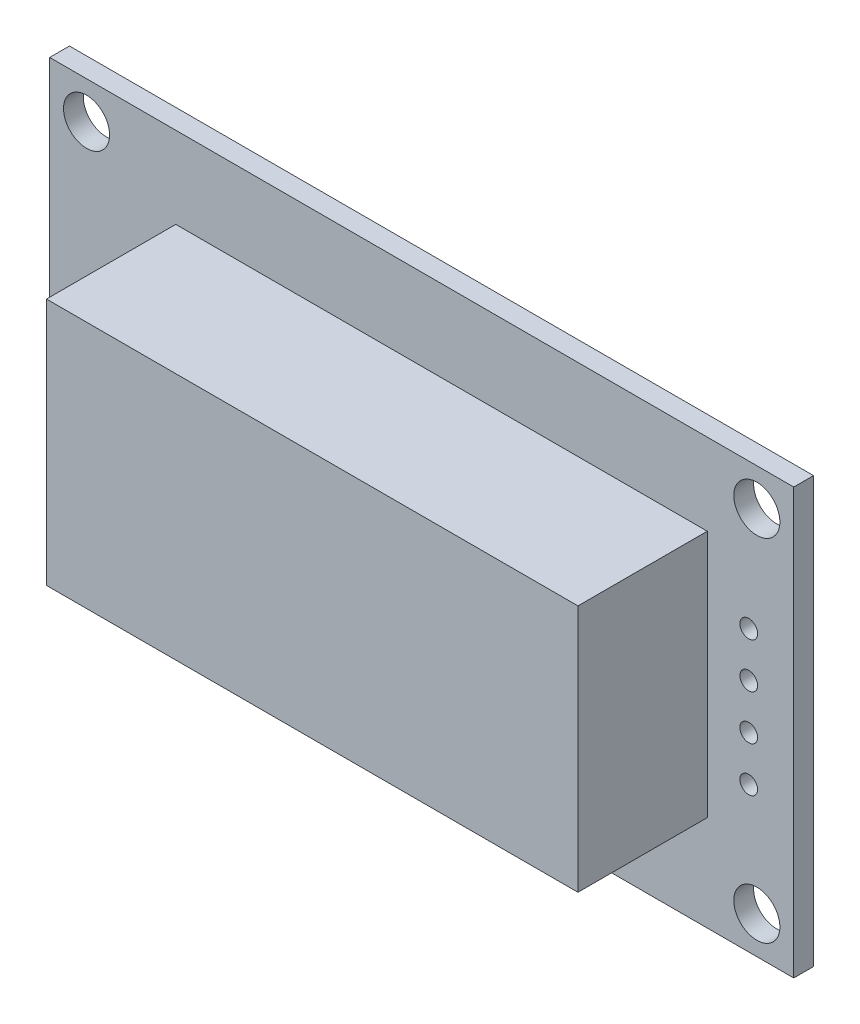
ISO-10303-21;
HEADER;
FILE_DESCRIPTION(('STEP AP214'),'2;1');
FILE_NAME('part.step','',(''),(''),'','','');
FILE_SCHEMA(('AUTOMOTIVE_DESIGN { 1 0 10303 214 1 1 1 1 }'));
ENDSEC;
DATA;
#1=APPLICATION_CONTEXT('core data for automotive mechanical design processes');
#2=APPLICATION_PROTOCOL_DEFINITION('international standard','automotive_design',2000,#1);
#3=PRODUCT_CONTEXT('',#1,'mechanical');
#4=PRODUCT('Part','Part','',(#3));
#5=PRODUCT_RELATED_PRODUCT_CATEGORY('part','',(#4));
#6=PRODUCT_DEFINITION_FORMATION('','',#4);
#7=PRODUCT_DEFINITION_CONTEXT('part definition',#1,'design');
#8=PRODUCT_DEFINITION('design','',#6,#7);
#9=PRODUCT_DEFINITION_SHAPE('','',#8);
#10=(LENGTH_UNIT() NAMED_UNIT(*) SI_UNIT(.MILLI.,.METRE.));
#11=(NAMED_UNIT(*) PLANE_ANGLE_UNIT() SI_UNIT($,.RADIAN.));
#12=(NAMED_UNIT(*) SI_UNIT($,.STERADIAN.) SOLID_ANGLE_UNIT());
#13=UNCERTAINTY_MEASURE_WITH_UNIT(LENGTH_MEASURE(1.E-05),#10,'distance_accuracy_value','');
#14=(GEOMETRIC_REPRESENTATION_CONTEXT(3) GLOBAL_UNCERTAINTY_ASSIGNED_CONTEXT((#13)) GLOBAL_UNIT_ASSIGNED_CONTEXT((#10,
#11,#12)) REPRESENTATION_CONTEXT('',''));
#15=CARTESIAN_POINT('',(0.,0.,0.));
#16=DIRECTION('',(0.,0.,1.));
#17=DIRECTION('',(1.,0.,0.));
#18=AXIS2_PLACEMENT_3D('',#15,#16,#17);
#19=CARTESIAN_POINT('',(0.,0.,0.));
#20=DIRECTION('',(0.,0.,1.));
#21=DIRECTION('',(1.,0.,0.));
#22=AXIS2_PLACEMENT_3D('',#19,#20,#21);
#23=PLANE('',#22);
#24=DIRECTION('',(0.,-1.,0.));
#25=VECTOR('',#24,1.);
#26=CARTESIAN_POINT('',(-8.64,5.9,0.));
#27=LINE('',#26,#25);
#28=CARTESIAN_POINT('',(-8.64,5.9,0.));
#29=VERTEX_POINT('',#28);
#30=CARTESIAN_POINT('',(-8.64000000000001,-6.35,0.));
#31=VERTEX_POINT('',#30);
#32=EDGE_CURVE('E167',#29,#31,#27,.T.);
#33=ORIENTED_EDGE('',*,*,#32,.F.);
#34=DIRECTION('',(1.,0.,0.));
#35=VECTOR('',#34,1.);
#36=CARTESIAN_POINT('',(-8.64,5.9,0.));
#37=LINE('',#36,#35);
#38=CARTESIAN_POINT('',(-17.64,5.9,0.));
#39=VERTEX_POINT('',#38);
#40=EDGE_CURVE('E180',#39,#29,#37,.T.);
#41=ORIENTED_EDGE('',*,*,#40,.F.);
#42=DIRECTION('',(0.,1.,0.));
#43=VECTOR('',#42,1.);
#44=CARTESIAN_POINT('',(-17.64,5.9,0.));
#45=LINE('',#44,#43);
#46=CARTESIAN_POINT('',(-17.64,-6.35,0.));
#47=VERTEX_POINT('',#46);
#48=EDGE_CURVE('E189',#47,#39,#45,.T.);
#49=ORIENTED_EDGE('',*,*,#48,.F.);
#50=DIRECTION('',(-1.,0.,0.));
#51=VECTOR('',#50,1.);
#52=CARTESIAN_POINT('',(-8.64000000000001,-6.35,0.));
#53=LINE('',#52,#51);
#54=EDGE_CURVE('E170',#31,#47,#53,.T.);
#55=ORIENTED_EDGE('',*,*,#54,.F.);
#56=EDGE_LOOP('',(#33,#41,#49,#55));
#57=FACE_BOUND('',#56,.T.);
#58=CARTESIAN_POINT('',(18.46,3.81,0.));
#59=DIRECTION('',(0.,0.,1.));
#60=DIRECTION('',(1.,0.,0.));
#61=AXIS2_PLACEMENT_3D('',#58,#59,#60);
#62=CIRCLE('',#61,0.499999999999999);
#63=CARTESIAN_POINT('',(18.96,3.81,0.));
#64=VERTEX_POINT('',#63);
#65=EDGE_CURVE('E206',#64,#64,#62,.T.);
#66=ORIENTED_EDGE('',*,*,#65,.T.);
#67=EDGE_LOOP('',(#66));
#68=FACE_BOUND('',#67,.T.);
#69=CARTESIAN_POINT('',(18.46,1.27,0.));
#70=DIRECTION('',(0.,0.,1.));
#71=DIRECTION('',(1.,0.,0.));
#72=AXIS2_PLACEMENT_3D('',#69,#70,#71);
#73=CIRCLE('',#72,0.499999999999999);
#74=CARTESIAN_POINT('',(18.96,1.27,0.));
#75=VERTEX_POINT('',#74);
#76=EDGE_CURVE('E210',#75,#75,#73,.T.);
#77=ORIENTED_EDGE('',*,*,#76,.T.);
#78=EDGE_LOOP('',(#77));
#79=FACE_BOUND('',#78,.T.);
#80=CARTESIAN_POINT('',(18.46,-1.27,0.));
#81=DIRECTION('',(0.,0.,1.));
#82=DIRECTION('',(1.,0.,0.));
#83=AXIS2_PLACEMENT_3D('',#80,#81,#82);
#84=CIRCLE('',#83,0.499999999999999);
#85=CARTESIAN_POINT('',(18.96,-1.27,0.));
#86=VERTEX_POINT('',#85);
#87=EDGE_CURVE('E213',#86,#86,#84,.T.);
#88=ORIENTED_EDGE('',*,*,#87,.T.);
#89=EDGE_LOOP('',(#88));
#90=FACE_BOUND('',#89,.T.);
#91=CARTESIAN_POINT('',(18.46,-3.81,0.));
#92=DIRECTION('',(0.,0.,1.));
#93=DIRECTION('',(1.,0.,0.));
#94=AXIS2_PLACEMENT_3D('',#91,#92,#93);
#95=CIRCLE('',#94,0.499999999999999);
#96=CARTESIAN_POINT('',(18.96,-3.81,0.));
#97=VERTEX_POINT('',#96);
#98=EDGE_CURVE('E205',#97,#97,#95,.T.);
#99=ORIENTED_EDGE('',*,*,#98,.T.);
#100=EDGE_LOOP('',(#99));
#101=FACE_BOUND('',#100,.T.);
#102=CARTESIAN_POINT('',(18.9175,9.8975,0.));
#103=DIRECTION('',(0.,0.,1.));
#104=DIRECTION('',(1.,0.,0.));
#105=AXIS2_PLACEMENT_3D('',#102,#103,#104);
#106=CIRCLE('',#105,1.3);
#107=CARTESIAN_POINT('',(20.2175,9.8975,0.));
#108=VERTEX_POINT('',#107);
#109=EDGE_CURVE('E262',#108,#108,#106,.T.);
#110=ORIENTED_EDGE('',*,*,#109,.T.);
#111=EDGE_LOOP('',(#110));
#112=FACE_BOUND('',#111,.T.);
#113=CARTESIAN_POINT('',(18.9175,-9.8975,0.));
#114=DIRECTION('',(0.,0.,1.));
#115=DIRECTION('',(1.,0.,0.));
#116=AXIS2_PLACEMENT_3D('',#113,#114,#115);
#117=CIRCLE('',#116,1.3);
#118=CARTESIAN_POINT('',(20.2175,-9.8975,0.));
#119=VERTEX_POINT('',#118);
#120=EDGE_CURVE('E273',#119,#119,#117,.T.);
#121=ORIENTED_EDGE('',*,*,#120,.T.);
#122=EDGE_LOOP('',(#121));
#123=FACE_BOUND('',#122,.T.);
#124=CARTESIAN_POINT('',(-18.9175,-9.8975,0.));
#125=DIRECTION('',(0.,0.,1.));
#126=DIRECTION('',(1.,0.,0.));
#127=AXIS2_PLACEMENT_3D('',#124,#125,#126);
#128=CIRCLE('',#127,1.3);
#129=CARTESIAN_POINT('',(-17.6175,-9.8975,0.));
#130=VERTEX_POINT('',#129);
#131=EDGE_CURVE('E267',#130,#130,#128,.T.);
#132=ORIENTED_EDGE('',*,*,#131,.T.);
#133=EDGE_LOOP('',(#132));
#134=FACE_BOUND('',#133,.T.);
#135=CARTESIAN_POINT('',(-18.9175,9.8975,0.));
#136=DIRECTION('',(0.,0.,1.));
#137=DIRECTION('',(1.,0.,0.));
#138=AXIS2_PLACEMENT_3D('',#135,#136,#137);
#139=CIRCLE('',#138,1.3);
#140=CARTESIAN_POINT('',(-17.6175,9.8975,0.));
#141=VERTEX_POINT('',#140);
#142=EDGE_CURVE('E266',#141,#141,#139,.T.);
#143=ORIENTED_EDGE('',*,*,#142,.T.);
#144=EDGE_LOOP('',(#143));
#145=FACE_BOUND('',#144,.T.);
#146=DIRECTION('',(0.,-1.,0.));
#147=VECTOR('',#146,1.);
#148=CARTESIAN_POINT('',(-21.,12.,0.));
#149=LINE('',#148,#147);
#150=CARTESIAN_POINT('',(-21.,12.,0.));
#151=VERTEX_POINT('',#150);
#152=CARTESIAN_POINT('',(-21.,-12.,0.));
#153=VERTEX_POINT('',#152);
#154=EDGE_CURVE('E284',#151,#153,#149,.T.);
#155=ORIENTED_EDGE('',*,*,#154,.F.);
#156=DIRECTION('',(-1.,0.,0.));
#157=VECTOR('',#156,1.);
#158=CARTESIAN_POINT('',(-21.,12.,0.));
#159=LINE('',#158,#157);
#160=CARTESIAN_POINT('',(21.,12.,0.));
#161=VERTEX_POINT('',#160);
#162=EDGE_CURVE('E291',#161,#151,#159,.T.);
#163=ORIENTED_EDGE('',*,*,#162,.F.);
#164=DIRECTION('',(0.,1.,0.));
#165=VECTOR('',#164,1.);
#166=CARTESIAN_POINT('',(21.,12.,0.));
#167=LINE('',#166,#165);
#168=CARTESIAN_POINT('',(21.,-12.,0.));
#169=VERTEX_POINT('',#168);
#170=EDGE_CURVE('E302',#169,#161,#167,.T.);
#171=ORIENTED_EDGE('',*,*,#170,.F.);
#172=DIRECTION('',(1.,0.,0.));
#173=VECTOR('',#172,1.);
#174=CARTESIAN_POINT('',(-21.,-12.,0.));
#175=LINE('',#174,#173);
#176=EDGE_CURVE('E300',#153,#169,#175,.T.);
#177=ORIENTED_EDGE('',*,*,#176,.F.);
#178=EDGE_LOOP('',(#155,#163,#171,#177));
#179=FACE_BOUND('',#178,.T.);
#180=DIRECTION('',(0.,-1.,0.));
#181=VECTOR('',#180,1.);
#182=CARTESIAN_POINT('',(-13.84,8.2092,0.));
#183=LINE('',#182,#181);
#184=CARTESIAN_POINT('',(-13.84,9.4092,0.));
#185=VERTEX_POINT('',#184);
#186=CARTESIAN_POINT('',(-13.84,8.2092,0.));
#187=VERTEX_POINT('',#186);
#188=EDGE_CURVE('E166',#185,#187,#183,.T.);
#189=ORIENTED_EDGE('',*,*,#188,.F.);
#190=DIRECTION('',(1.,0.,0.));
#191=VECTOR('',#190,1.);
#192=CARTESIAN_POINT('',(-13.84,9.4092,0.));
#193=LINE('',#192,#191);
#194=CARTESIAN_POINT('',(-17.,9.4092,0.));
#195=VERTEX_POINT('',#194);
#196=EDGE_CURVE('E163',#195,#185,#193,.T.);
#197=ORIENTED_EDGE('',*,*,#196,.F.);
#198=DIRECTION('',(0.,1.,0.));
#199=VECTOR('',#198,1.);
#200=CARTESIAN_POINT('',(-17.,8.2092,0.));
#201=LINE('',#200,#199);
#202=CARTESIAN_POINT('',(-17.,8.2092,0.));
#203=VERTEX_POINT('',#202);
#204=EDGE_CURVE('E53',#203,#195,#201,.T.);
#205=ORIENTED_EDGE('',*,*,#204,.F.);
#206=DIRECTION('',(-1.,0.,0.));
#207=VECTOR('',#206,1.);
#208=CARTESIAN_POINT('',(-13.84,8.2092,0.));
#209=LINE('',#208,#207);
#210=EDGE_CURVE('E48',#187,#203,#209,.T.);
#211=ORIENTED_EDGE('',*,*,#210,.F.);
#212=EDGE_LOOP('',(#189,#197,#205,#211));
#213=FACE_BOUND('',#212,.T.);
#214=ADVANCED_FACE('F33',(#57,#68,#79,#90,#101,#112,#123,#134,#145,#179,#213),#23,.F.);
#215=CARTESIAN_POINT('',(-21.,12.,1.1176));
#216=DIRECTION('',(1.,0.,0.));
#217=DIRECTION('',(0.,1.,0.));
#218=AXIS2_PLACEMENT_3D('',#215,#216,#217);
#219=PLANE('',#218);
#220=ORIENTED_EDGE('',*,*,#154,.T.);
#221=DIRECTION('',(0.,0.,-1.));
#222=VECTOR('',#221,1.);
#223=CARTESIAN_POINT('',(-21.,-12.,1.1176));
#224=LINE('',#223,#222);
#225=CARTESIAN_POINT('',(-21.,-12.,1.1176));
#226=VERTEX_POINT('',#225);
#227=EDGE_CURVE('E11',#226,#153,#224,.T.);
#228=ORIENTED_EDGE('',*,*,#227,.F.);
#229=DIRECTION('',(0.,-1.,0.));
#230=VECTOR('',#229,1.);
#231=CARTESIAN_POINT('',(-21.,12.,1.1176));
#232=LINE('',#231,#230);
#233=CARTESIAN_POINT('',(-21.,12.,1.1176));
#234=VERTEX_POINT('',#233);
#235=EDGE_CURVE('E287',#234,#226,#232,.T.);
#236=ORIENTED_EDGE('',*,*,#235,.F.);
#237=DIRECTION('',(0.,0.,-1.));
#238=VECTOR('',#237,1.);
#239=CARTESIAN_POINT('',(-21.,12.,1.1176));
#240=LINE('',#239,#238);
#241=EDGE_CURVE('E297',#234,#151,#240,.T.);
#242=ORIENTED_EDGE('',*,*,#241,.T.);
#243=EDGE_LOOP('',(#220,#228,#236,#242));
#244=FACE_BOUND('',#243,.T.);
#245=ADVANCED_FACE('F35',(#244),#219,.F.);
#246=CARTESIAN_POINT('',(-21.,-12.,1.1176));
#247=DIRECTION('',(0.,1.,0.));
#248=DIRECTION('',(-1.,0.,0.));
#249=AXIS2_PLACEMENT_3D('',#246,#247,#248);
#250=PLANE('',#249);
#251=ORIENTED_EDGE('',*,*,#176,.T.);
#252=DIRECTION('',(0.,0.,-1.));
#253=VECTOR('',#252,1.);
#254=CARTESIAN_POINT('',(21.,-12.,1.1176));
#255=LINE('',#254,#253);
#256=CARTESIAN_POINT('',(21.,-12.,1.1176));
#257=VERTEX_POINT('',#256);
#258=EDGE_CURVE('E41',#257,#169,#255,.T.);
#259=ORIENTED_EDGE('',*,*,#258,.F.);
#260=DIRECTION('',(1.,0.,0.));
#261=VECTOR('',#260,1.);
#262=CARTESIAN_POINT('',(-21.,-12.,1.1176));
#263=LINE('',#262,#261);
#264=EDGE_CURVE('E290',#226,#257,#263,.T.);
#265=ORIENTED_EDGE('',*,*,#264,.F.);
#266=ORIENTED_EDGE('',*,*,#227,.T.);
#267=EDGE_LOOP('',(#251,#259,#265,#266));
#268=FACE_BOUND('',#267,.T.);
#269=ADVANCED_FACE('F329',(#268),#250,.F.);
#270=CARTESIAN_POINT('',(21.,12.,1.1176));
#271=DIRECTION('',(-1.,0.,0.));
#272=DIRECTION('',(0.,-1.,0.));
#273=AXIS2_PLACEMENT_3D('',#270,#271,#272);
#274=PLANE('',#273);
#275=ORIENTED_EDGE('',*,*,#170,.T.);
#276=DIRECTION('',(0.,0.,-1.));
#277=VECTOR('',#276,1.);
#278=CARTESIAN_POINT('',(21.,12.,1.1176));
#279=LINE('',#278,#277);
#280=CARTESIAN_POINT('',(21.,12.,1.1176));
#281=VERTEX_POINT('',#280);
#282=EDGE_CURVE('E307',#281,#161,#279,.T.);
#283=ORIENTED_EDGE('',*,*,#282,.F.);
#284=DIRECTION('',(0.,1.,0.));
#285=VECTOR('',#284,1.);
#286=CARTESIAN_POINT('',(21.,12.,1.1176));
#287=LINE('',#286,#285);
#288=EDGE_CURVE('E293',#257,#281,#287,.T.);
#289=ORIENTED_EDGE('',*,*,#288,.F.);
#290=ORIENTED_EDGE('',*,*,#258,.T.);
#291=EDGE_LOOP('',(#275,#283,#289,#290));
#292=FACE_BOUND('',#291,.T.);
#293=ADVANCED_FACE('F314',(#292),#274,.F.);
#294=CARTESIAN_POINT('',(-21.,12.,1.1176));
#295=DIRECTION('',(0.,-1.,0.));
#296=DIRECTION('',(1.,0.,0.));
#297=AXIS2_PLACEMENT_3D('',#294,#295,#296);
#298=PLANE('',#297);
#299=ORIENTED_EDGE('',*,*,#162,.T.);
#300=ORIENTED_EDGE('',*,*,#241,.F.);
#301=DIRECTION('',(-1.,0.,0.));
#302=VECTOR('',#301,1.);
#303=CARTESIAN_POINT('',(-21.,12.,1.1176));
#304=LINE('',#303,#302);
#305=EDGE_CURVE('E295',#281,#234,#304,.T.);
#306=ORIENTED_EDGE('',*,*,#305,.F.);
#307=ORIENTED_EDGE('',*,*,#282,.T.);
#308=EDGE_LOOP('',(#299,#300,#306,#307));
#309=FACE_BOUND('',#308,.T.);
#310=ADVANCED_FACE('F322',(#309),#298,.F.);
#311=CARTESIAN_POINT('',(0.,0.,1.1176));
#312=DIRECTION('',(0.,0.,1.));
#313=DIRECTION('',(1.,0.,0.));
#314=AXIS2_PLACEMENT_3D('',#311,#312,#313);
#315=PLANE('',#314);
#316=CARTESIAN_POINT('',(18.46,3.81,1.1176));
#317=DIRECTION('',(0.,0.,1.));
#318=DIRECTION('',(1.,0.,0.));
#319=AXIS2_PLACEMENT_3D('',#316,#317,#318);
#320=CIRCLE('',#319,0.499999999999999);
#321=CARTESIAN_POINT('',(18.96,3.81,1.1176));
#322=VERTEX_POINT('',#321);
#323=EDGE_CURVE('E226',#322,#322,#320,.F.);
#324=ORIENTED_EDGE('',*,*,#323,.T.);
#325=EDGE_LOOP('',(#324));
#326=FACE_BOUND('',#325,.T.);
#327=CARTESIAN_POINT('',(18.46,1.27,1.1176));
#328=DIRECTION('',(0.,0.,1.));
#329=DIRECTION('',(1.,0.,0.));
#330=AXIS2_PLACEMENT_3D('',#327,#328,#329);
#331=CIRCLE('',#330,0.499999999999999);
#332=CARTESIAN_POINT('',(18.96,1.27,1.1176));
#333=VERTEX_POINT('',#332);
#334=EDGE_CURVE('E223',#333,#333,#331,.F.);
#335=ORIENTED_EDGE('',*,*,#334,.T.);
#336=EDGE_LOOP('',(#335));
#337=FACE_BOUND('',#336,.T.);
#338=CARTESIAN_POINT('',(18.46,-1.27,1.1176));
#339=DIRECTION('',(0.,0.,1.));
#340=DIRECTION('',(1.,0.,0.));
#341=AXIS2_PLACEMENT_3D('',#338,#339,#340);
#342=CIRCLE('',#341,0.499999999999999);
#343=CARTESIAN_POINT('',(18.96,-1.27,1.1176));
#344=VERTEX_POINT('',#343);
#345=EDGE_CURVE('E220',#344,#344,#342,.F.);
#346=ORIENTED_EDGE('',*,*,#345,.T.);
#347=EDGE_LOOP('',(#346));
#348=FACE_BOUND('',#347,.T.);
#349=CARTESIAN_POINT('',(18.46,-3.81,1.1176));
#350=DIRECTION('',(0.,0.,1.));
#351=DIRECTION('',(1.,0.,0.));
#352=AXIS2_PLACEMENT_3D('',#349,#350,#351);
#353=CIRCLE('',#352,0.499999999999999);
#354=CARTESIAN_POINT('',(18.96,-3.81,1.1176));
#355=VERTEX_POINT('',#354);
#356=EDGE_CURVE('E209',#355,#355,#353,.F.);
#357=ORIENTED_EDGE('',*,*,#356,.T.);
#358=EDGE_LOOP('',(#357));
#359=FACE_BOUND('',#358,.T.);
#360=DIRECTION('',(0.,-1.,0.));
#361=VECTOR('',#360,1.);
#362=CARTESIAN_POINT('',(-13.88,7.4,1.1176));
#363=LINE('',#362,#361);
#364=CARTESIAN_POINT('',(-13.88,7.4,1.1176));
#365=VERTEX_POINT('',#364);
#366=CARTESIAN_POINT('',(-13.88,-6.6,1.1176));
#367=VERTEX_POINT('',#366);
#368=EDGE_CURVE('E229',#365,#367,#363,.T.);
#369=ORIENTED_EDGE('',*,*,#368,.F.);
#370=DIRECTION('',(-1.,0.,0.));
#371=VECTOR('',#370,1.);
#372=CARTESIAN_POINT('',(-13.88,7.4,1.1176));
#373=LINE('',#372,#371);
#374=CARTESIAN_POINT('',(16.12,7.4,1.1176));
#375=VERTEX_POINT('',#374);
#376=EDGE_CURVE('E234',#375,#365,#373,.T.);
#377=ORIENTED_EDGE('',*,*,#376,.F.);
#378=DIRECTION('',(0.,1.,0.));
#379=VECTOR('',#378,1.);
#380=CARTESIAN_POINT('',(16.12,7.4,1.1176));
#381=LINE('',#380,#379);
#382=CARTESIAN_POINT('',(16.12,-6.6,1.1176));
#383=VERTEX_POINT('',#382);
#384=EDGE_CURVE('E246',#383,#375,#381,.T.);
#385=ORIENTED_EDGE('',*,*,#384,.F.);
#386=DIRECTION('',(1.,0.,0.));
#387=VECTOR('',#386,1.);
#388=CARTESIAN_POINT('',(-13.88,-6.6,1.1176));
#389=LINE('',#388,#387);
#390=EDGE_CURVE('E243',#367,#383,#389,.T.);
#391=ORIENTED_EDGE('',*,*,#390,.F.);
#392=EDGE_LOOP('',(#369,#377,#385,#391));
#393=FACE_BOUND('',#392,.T.);
#394=CARTESIAN_POINT('',(18.9175,9.8975,1.1176));
#395=DIRECTION('',(0.,0.,1.));
#396=DIRECTION('',(1.,0.,0.));
#397=AXIS2_PLACEMENT_3D('',#394,#395,#396);
#398=CIRCLE('',#397,1.3);
#399=CARTESIAN_POINT('',(20.2175,9.8975,1.1176));
#400=VERTEX_POINT('',#399);
#401=EDGE_CURVE('E276',#400,#400,#398,.T.);
#402=ORIENTED_EDGE('',*,*,#401,.F.);
#403=EDGE_LOOP('',(#402));
#404=FACE_BOUND('',#403,.T.);
#405=CARTESIAN_POINT('',(18.9175,-9.8975,1.1176));
#406=DIRECTION('',(0.,0.,1.));
#407=DIRECTION('',(1.,0.,0.));
#408=AXIS2_PLACEMENT_3D('',#405,#406,#407);
#409=CIRCLE('',#408,1.3);
#410=CARTESIAN_POINT('',(20.2175,-9.8975,1.1176));
#411=VERTEX_POINT('',#410);
#412=EDGE_CURVE('E270',#411,#411,#409,.T.);
#413=ORIENTED_EDGE('',*,*,#412,.F.);
#414=EDGE_LOOP('',(#413));
#415=FACE_BOUND('',#414,.T.);
#416=CARTESIAN_POINT('',(-18.9175,-9.8975,1.1176));
#417=DIRECTION('',(0.,0.,1.));
#418=DIRECTION('',(1.,0.,0.));
#419=AXIS2_PLACEMENT_3D('',#416,#417,#418);
#420=CIRCLE('',#419,1.3);
#421=CARTESIAN_POINT('',(-17.6175,-9.8975,1.1176));
#422=VERTEX_POINT('',#421);
#423=EDGE_CURVE('E263',#422,#422,#420,.T.);
#424=ORIENTED_EDGE('',*,*,#423,.F.);
#425=EDGE_LOOP('',(#424));
#426=FACE_BOUND('',#425,.T.);
#427=CARTESIAN_POINT('',(-18.9175,9.8975,1.1176));
#428=DIRECTION('',(0.,0.,1.));
#429=DIRECTION('',(1.,0.,0.));
#430=AXIS2_PLACEMENT_3D('',#427,#428,#429);
#431=CIRCLE('',#430,1.3);
#432=CARTESIAN_POINT('',(-17.6175,9.8975,1.1176));
#433=VERTEX_POINT('',#432);
#434=EDGE_CURVE('E281',#433,#433,#431,.T.);
#435=ORIENTED_EDGE('',*,*,#434,.F.);
#436=EDGE_LOOP('',(#435));
#437=FACE_BOUND('',#436,.T.);
#438=ORIENTED_EDGE('',*,*,#235,.T.);
#439=ORIENTED_EDGE('',*,*,#264,.T.);
#440=ORIENTED_EDGE('',*,*,#288,.T.);
#441=ORIENTED_EDGE('',*,*,#305,.T.);
#442=EDGE_LOOP('',(#438,#439,#440,#441));
#443=FACE_BOUND('',#442,.T.);
#444=ADVANCED_FACE('F328',(#326,#337,#348,#359,#393,#404,#415,#426,#437,#443),#315,.T.);
#445=CARTESIAN_POINT('',(-18.9175,9.8975,1.1176));
#446=DIRECTION('',(0.,0.,-1.));
#447=DIRECTION('',(-1.,0.,0.));
#448=AXIS2_PLACEMENT_3D('',#445,#446,#447);
#449=CYLINDRICAL_SURFACE('',#448,1.3);
#450=ORIENTED_EDGE('',*,*,#434,.T.);
#451=EDGE_LOOP('',(#450));
#452=FACE_BOUND('',#451,.T.);
#453=ORIENTED_EDGE('',*,*,#142,.F.);
#454=EDGE_LOOP('',(#453));
#455=FACE_BOUND('',#454,.T.);
#456=ADVANCED_FACE('F352',(#452,#455),#449,.F.);
#457=CARTESIAN_POINT('',(-18.9175,-9.8975,1.1176));
#458=DIRECTION('',(0.,0.,-1.));
#459=DIRECTION('',(-1.,0.,0.));
#460=AXIS2_PLACEMENT_3D('',#457,#458,#459);
#461=CYLINDRICAL_SURFACE('',#460,1.3);
#462=ORIENTED_EDGE('',*,*,#423,.T.);
#463=EDGE_LOOP('',(#462));
#464=FACE_BOUND('',#463,.T.);
#465=ORIENTED_EDGE('',*,*,#131,.F.);
#466=EDGE_LOOP('',(#465));
#467=FACE_BOUND('',#466,.T.);
#468=ADVANCED_FACE('F358',(#464,#467),#461,.F.);
#469=CARTESIAN_POINT('',(18.9175,-9.8975,1.1176));
#470=DIRECTION('',(0.,0.,-1.));
#471=DIRECTION('',(-1.,0.,0.));
#472=AXIS2_PLACEMENT_3D('',#469,#470,#471);
#473=CYLINDRICAL_SURFACE('',#472,1.3);
#474=ORIENTED_EDGE('',*,*,#412,.T.);
#475=EDGE_LOOP('',(#474));
#476=FACE_BOUND('',#475,.T.);
#477=ORIENTED_EDGE('',*,*,#120,.F.);
#478=EDGE_LOOP('',(#477));
#479=FACE_BOUND('',#478,.T.);
#480=ADVANCED_FACE('F382',(#476,#479),#473,.F.);
#481=CARTESIAN_POINT('',(18.9175,9.8975,1.1176));
#482=DIRECTION('',(0.,0.,-1.));
#483=DIRECTION('',(-1.,0.,0.));
#484=AXIS2_PLACEMENT_3D('',#481,#482,#483);
#485=CYLINDRICAL_SURFACE('',#484,1.3);
#486=ORIENTED_EDGE('',*,*,#401,.T.);
#487=EDGE_LOOP('',(#486));
#488=FACE_BOUND('',#487,.T.);
#489=ORIENTED_EDGE('',*,*,#109,.F.);
#490=EDGE_LOOP('',(#489));
#491=FACE_BOUND('',#490,.T.);
#492=ADVANCED_FACE('F389',(#488,#491),#485,.F.);
#493=CARTESIAN_POINT('',(-13.88,7.4,8.4176));
#494=DIRECTION('',(1.,0.,0.));
#495=DIRECTION('',(0.,1.,0.));
#496=AXIS2_PLACEMENT_3D('',#493,#494,#495);
#497=PLANE('',#496);
#498=ORIENTED_EDGE('',*,*,#368,.T.);
#499=DIRECTION('',(0.,0.,-1.));
#500=VECTOR('',#499,1.);
#501=CARTESIAN_POINT('',(-13.88,-6.6,8.4176));
#502=LINE('',#501,#500);
#503=CARTESIAN_POINT('',(-13.88,-6.6,8.4176));
#504=VERTEX_POINT('',#503);
#505=EDGE_CURVE('E259',#504,#367,#502,.T.);
#506=ORIENTED_EDGE('',*,*,#505,.F.);
#507=DIRECTION('',(0.,-1.,0.));
#508=VECTOR('',#507,1.);
#509=CARTESIAN_POINT('',(-13.88,7.4,8.4176));
#510=LINE('',#509,#508);
#511=CARTESIAN_POINT('',(-13.88,7.4,8.4176));
#512=VERTEX_POINT('',#511);
#513=EDGE_CURVE('E230',#512,#504,#510,.T.);
#514=ORIENTED_EDGE('',*,*,#513,.F.);
#515=DIRECTION('',(0.,0.,-1.));
#516=VECTOR('',#515,1.);
#517=CARTESIAN_POINT('',(-13.88,7.4,8.4176));
#518=LINE('',#517,#516);
#519=EDGE_CURVE('E240',#512,#365,#518,.T.);
#520=ORIENTED_EDGE('',*,*,#519,.T.);
#521=EDGE_LOOP('',(#498,#506,#514,#520));
#522=FACE_BOUND('',#521,.T.);
#523=ADVANCED_FACE('F393',(#522),#497,.F.);
#524=CARTESIAN_POINT('',(-13.88,-6.6,8.4176));
#525=DIRECTION('',(0.,1.,0.));
#526=DIRECTION('',(0.,0.,1.));
#527=AXIS2_PLACEMENT_3D('',#524,#525,#526);
#528=PLANE('',#527);
#529=ORIENTED_EDGE('',*,*,#390,.T.);
#530=DIRECTION('',(0.,0.,-1.));
#531=VECTOR('',#530,1.);
#532=CARTESIAN_POINT('',(16.12,-6.6,8.4176));
#533=LINE('',#532,#531);
#534=CARTESIAN_POINT('',(16.12,-6.6,8.4176));
#535=VERTEX_POINT('',#534);
#536=EDGE_CURVE('E256',#535,#383,#533,.T.);
#537=ORIENTED_EDGE('',*,*,#536,.F.);
#538=DIRECTION('',(1.,0.,0.));
#539=VECTOR('',#538,1.);
#540=CARTESIAN_POINT('',(-13.88,-6.6,8.4176));
#541=LINE('',#540,#539);
#542=EDGE_CURVE('E233',#504,#535,#541,.T.);
#543=ORIENTED_EDGE('',*,*,#542,.F.);
#544=ORIENTED_EDGE('',*,*,#505,.T.);
#545=EDGE_LOOP('',(#529,#537,#543,#544));
#546=FACE_BOUND('',#545,.T.);
#547=ADVANCED_FACE('F401',(#546),#528,.F.);
#548=CARTESIAN_POINT('',(16.12,7.4,8.4176));
#549=DIRECTION('',(-1.,0.,0.));
#550=DIRECTION('',(0.,0.,1.));
#551=AXIS2_PLACEMENT_3D('',#548,#549,#550);
#552=PLANE('',#551);
#553=ORIENTED_EDGE('',*,*,#384,.T.);
#554=DIRECTION('',(0.,0.,-1.));
#555=VECTOR('',#554,1.);
#556=CARTESIAN_POINT('',(16.12,7.4,8.4176));
#557=LINE('',#556,#555);
#558=CARTESIAN_POINT('',(16.12,7.4,8.4176));
#559=VERTEX_POINT('',#558);
#560=EDGE_CURVE('E253',#559,#375,#557,.T.);
#561=ORIENTED_EDGE('',*,*,#560,.F.);
#562=DIRECTION('',(0.,1.,0.));
#563=VECTOR('',#562,1.);
#564=CARTESIAN_POINT('',(16.12,7.4,8.4176));
#565=LINE('',#564,#563);
#566=EDGE_CURVE('E236',#535,#559,#565,.T.);
#567=ORIENTED_EDGE('',*,*,#566,.F.);
#568=ORIENTED_EDGE('',*,*,#536,.T.);
#569=EDGE_LOOP('',(#553,#561,#567,#568));
#570=FACE_BOUND('',#569,.T.);
#571=ADVANCED_FACE('F412',(#570),#552,.F.);
#572=CARTESIAN_POINT('',(-13.88,7.4,8.4176));
#573=DIRECTION('',(0.,-1.,0.));
#574=DIRECTION('',(0.,0.,-1.));
#575=AXIS2_PLACEMENT_3D('',#572,#573,#574);
#576=PLANE('',#575);
#577=ORIENTED_EDGE('',*,*,#376,.T.);
#578=ORIENTED_EDGE('',*,*,#519,.F.);
#579=DIRECTION('',(-1.,0.,0.));
#580=VECTOR('',#579,1.);
#581=CARTESIAN_POINT('',(-13.88,7.4,8.4176));
#582=LINE('',#581,#580);
#583=EDGE_CURVE('E238',#559,#512,#582,.T.);
#584=ORIENTED_EDGE('',*,*,#583,.F.);
#585=ORIENTED_EDGE('',*,*,#560,.T.);
#586=EDGE_LOOP('',(#577,#578,#584,#585));
#587=FACE_BOUND('',#586,.T.);
#588=ADVANCED_FACE('F419',(#587),#576,.F.);
#589=CARTESIAN_POINT('',(0.,0.,8.4176));
#590=DIRECTION('',(0.,0.,1.));
#591=DIRECTION('',(1.,0.,0.));
#592=AXIS2_PLACEMENT_3D('',#589,#590,#591);
#593=PLANE('',#592);
#594=ORIENTED_EDGE('',*,*,#513,.T.);
#595=ORIENTED_EDGE('',*,*,#542,.T.);
#596=ORIENTED_EDGE('',*,*,#566,.T.);
#597=ORIENTED_EDGE('',*,*,#583,.T.);
#598=EDGE_LOOP('',(#594,#595,#596,#597));
#599=FACE_BOUND('',#598,.T.);
#600=ADVANCED_FACE('F425',(#599),#593,.T.);
#601=CARTESIAN_POINT('',(18.46,-3.81,8.4176));
#602=DIRECTION('',(0.,0.,-1.));
#603=DIRECTION('',(-1.,0.,0.));
#604=AXIS2_PLACEMENT_3D('',#601,#602,#603);
#605=CYLINDRICAL_SURFACE('',#604,0.499999999999999);
#606=ORIENTED_EDGE('',*,*,#356,.F.);
#607=EDGE_LOOP('',(#606));
#608=FACE_BOUND('',#607,.T.);
#609=ORIENTED_EDGE('',*,*,#98,.F.);
#610=EDGE_LOOP('',(#609));
#611=FACE_BOUND('',#610,.T.);
#612=ADVANCED_FACE('F427',(#608,#611),#605,.F.);
#613=CARTESIAN_POINT('',(18.46,-1.27,8.4176));
#614=DIRECTION('',(0.,0.,-1.));
#615=DIRECTION('',(-1.,0.,0.));
#616=AXIS2_PLACEMENT_3D('',#613,#614,#615);
#617=CYLINDRICAL_SURFACE('',#616,0.499999999999999);
#618=ORIENTED_EDGE('',*,*,#345,.F.);
#619=EDGE_LOOP('',(#618));
#620=FACE_BOUND('',#619,.T.);
#621=ORIENTED_EDGE('',*,*,#87,.F.);
#622=EDGE_LOOP('',(#621));
#623=FACE_BOUND('',#622,.T.);
#624=ADVANCED_FACE('F432',(#620,#623),#617,.F.);
#625=CARTESIAN_POINT('',(18.46,1.27,8.4176));
#626=DIRECTION('',(0.,0.,-1.));
#627=DIRECTION('',(-1.,0.,0.));
#628=AXIS2_PLACEMENT_3D('',#625,#626,#627);
#629=CYLINDRICAL_SURFACE('',#628,0.499999999999999);
#630=ORIENTED_EDGE('',*,*,#334,.F.);
#631=EDGE_LOOP('',(#630));
#632=FACE_BOUND('',#631,.T.);
#633=ORIENTED_EDGE('',*,*,#76,.F.);
#634=EDGE_LOOP('',(#633));
#635=FACE_BOUND('',#634,.T.);
#636=ADVANCED_FACE('F465',(#632,#635),#629,.F.);
#637=CARTESIAN_POINT('',(18.46,3.81,8.4176));
#638=DIRECTION('',(0.,0.,-1.));
#639=DIRECTION('',(-1.,0.,0.));
#640=AXIS2_PLACEMENT_3D('',#637,#638,#639);
#641=CYLINDRICAL_SURFACE('',#640,0.499999999999999);
#642=ORIENTED_EDGE('',*,*,#323,.F.);
#643=EDGE_LOOP('',(#642));
#644=FACE_BOUND('',#643,.T.);
#645=ORIENTED_EDGE('',*,*,#65,.F.);
#646=EDGE_LOOP('',(#645));
#647=FACE_BOUND('',#646,.T.);
#648=ADVANCED_FACE('F473',(#644,#647),#641,.F.);
#649=CARTESIAN_POINT('',(-8.64,5.9,-2.5));
#650=DIRECTION('',(-1.,0.,0.));
#651=DIRECTION('',(0.,-1.,0.));
#652=AXIS2_PLACEMENT_3D('',#649,#650,#651);
#653=PLANE('',#652);
#654=ORIENTED_EDGE('',*,*,#32,.T.);
#655=DIRECTION('',(0.,0.,1.));
#656=VECTOR('',#655,1.);
#657=CARTESIAN_POINT('',(-8.64000000000001,-6.35,-2.5));
#658=LINE('',#657,#656);
#659=CARTESIAN_POINT('',(-8.64000000000001,-6.35,-2.5));
#660=VERTEX_POINT('',#659);
#661=EDGE_CURVE('E202',#660,#31,#658,.T.);
#662=ORIENTED_EDGE('',*,*,#661,.F.);
#663=DIRECTION('',(0.,-1.,0.));
#664=VECTOR('',#663,1.);
#665=CARTESIAN_POINT('',(-8.64,5.9,-2.5));
#666=LINE('',#665,#664);
#667=CARTESIAN_POINT('',(-8.64,5.9,-2.5));
#668=VERTEX_POINT('',#667);
#669=EDGE_CURVE('E176',#668,#660,#666,.T.);
#670=ORIENTED_EDGE('',*,*,#669,.F.);
#671=DIRECTION('',(0.,0.,1.));
#672=VECTOR('',#671,1.);
#673=CARTESIAN_POINT('',(-8.64,5.9,-2.5));
#674=LINE('',#673,#672);
#675=EDGE_CURVE('E185',#668,#29,#674,.T.);
#676=ORIENTED_EDGE('',*,*,#675,.T.);
#677=EDGE_LOOP('',(#654,#662,#670,#676));
#678=FACE_BOUND('',#677,.T.);
#679=ADVANCED_FACE('F482',(#678),#653,.F.);
#680=CARTESIAN_POINT('',(-8.64000000000001,-6.35,-2.5));
#681=DIRECTION('',(0.,1.,0.));
#682=DIRECTION('',(0.,0.,1.));
#683=AXIS2_PLACEMENT_3D('',#680,#681,#682);
#684=PLANE('',#683);
#685=ORIENTED_EDGE('',*,*,#54,.T.);
#686=DIRECTION('',(0.,0.,1.));
#687=VECTOR('',#686,1.);
#688=CARTESIAN_POINT('',(-17.64,-6.35,-2.5));
#689=LINE('',#688,#687);
#690=CARTESIAN_POINT('',(-17.64,-6.35,-2.5));
#691=VERTEX_POINT('',#690);
#692=EDGE_CURVE('E199',#691,#47,#689,.T.);
#693=ORIENTED_EDGE('',*,*,#692,.F.);
#694=DIRECTION('',(-1.,0.,0.));
#695=VECTOR('',#694,1.);
#696=CARTESIAN_POINT('',(-8.64000000000001,-6.35,-2.5));
#697=LINE('',#696,#695);
#698=EDGE_CURVE('E179',#660,#691,#697,.T.);
#699=ORIENTED_EDGE('',*,*,#698,.F.);
#700=ORIENTED_EDGE('',*,*,#661,.T.);
#701=EDGE_LOOP('',(#685,#693,#699,#700));
#702=FACE_BOUND('',#701,.T.);
#703=ADVANCED_FACE('F491',(#702),#684,.F.);
#704=CARTESIAN_POINT('',(-17.64,5.9,-2.5));
#705=DIRECTION('',(1.,0.,0.));
#706=DIRECTION('',(0.,1.,0.));
#707=AXIS2_PLACEMENT_3D('',#704,#705,#706);
#708=PLANE('',#707);
#709=ORIENTED_EDGE('',*,*,#48,.T.);
#710=DIRECTION('',(0.,0.,1.));
#711=VECTOR('',#710,1.);
#712=CARTESIAN_POINT('',(-17.64,5.9,-2.5));
#713=LINE('',#712,#711);
#714=CARTESIAN_POINT('',(-17.64,5.9,-2.5));
#715=VERTEX_POINT('',#714);
#716=EDGE_CURVE('E196',#715,#39,#713,.T.);
#717=ORIENTED_EDGE('',*,*,#716,.F.);
#718=DIRECTION('',(0.,1.,0.));
#719=VECTOR('',#718,1.);
#720=CARTESIAN_POINT('',(-17.64,5.9,-2.5));
#721=LINE('',#720,#719);
#722=EDGE_CURVE('E182',#691,#715,#721,.T.);
#723=ORIENTED_EDGE('',*,*,#722,.F.);
#724=ORIENTED_EDGE('',*,*,#692,.T.);
#725=EDGE_LOOP('',(#709,#717,#723,#724));
#726=FACE_BOUND('',#725,.T.);
#727=ADVANCED_FACE('F500',(#726),#708,.F.);
#728=CARTESIAN_POINT('',(-8.64,5.9,-2.5));
#729=DIRECTION('',(0.,-1.,0.));
#730=DIRECTION('',(1.,0.,0.));
#731=AXIS2_PLACEMENT_3D('',#728,#729,#730);
#732=PLANE('',#731);
#733=ORIENTED_EDGE('',*,*,#40,.T.);
#734=ORIENTED_EDGE('',*,*,#675,.F.);
#735=DIRECTION('',(1.,0.,0.));
#736=VECTOR('',#735,1.);
#737=CARTESIAN_POINT('',(-8.64,5.9,-2.5));
#738=LINE('',#737,#736);
#739=EDGE_CURVE('E184',#715,#668,#738,.T.);
#740=ORIENTED_EDGE('',*,*,#739,.F.);
#741=ORIENTED_EDGE('',*,*,#716,.T.);
#742=EDGE_LOOP('',(#733,#734,#740,#741));
#743=FACE_BOUND('',#742,.T.);
#744=ADVANCED_FACE('F509',(#743),#732,.F.);
#745=CARTESIAN_POINT('',(0.,0.,-2.5));
#746=DIRECTION('',(0.,0.,-1.));
#747=DIRECTION('',(-1.,0.,0.));
#748=AXIS2_PLACEMENT_3D('',#745,#746,#747);
#749=PLANE('',#748);
#750=ORIENTED_EDGE('',*,*,#669,.T.);
#751=ORIENTED_EDGE('',*,*,#698,.T.);
#752=ORIENTED_EDGE('',*,*,#722,.T.);
#753=ORIENTED_EDGE('',*,*,#739,.T.);
#754=EDGE_LOOP('',(#750,#751,#752,#753));
#755=FACE_BOUND('',#754,.T.);
#756=ADVANCED_FACE('F518',(#755),#749,.T.);
#757=CARTESIAN_POINT('',(-13.84,8.2092,-1.2));
#758=DIRECTION('',(-1.,0.,0.));
#759=DIRECTION('',(0.,0.,1.));
#760=AXIS2_PLACEMENT_3D('',#757,#758,#759);
#761=PLANE('',#760);
#762=ORIENTED_EDGE('',*,*,#188,.T.);
#763=DIRECTION('',(0.,0.,1.));
#764=VECTOR('',#763,1.);
#765=CARTESIAN_POINT('',(-13.84,8.2092,-1.2));
#766=LINE('',#765,#764);
#767=CARTESIAN_POINT('',(-13.84,8.2092,-1.2));
#768=VERTEX_POINT('',#767);
#769=EDGE_CURVE('E147',#768,#187,#766,.T.);
#770=ORIENTED_EDGE('',*,*,#769,.F.);
#771=DIRECTION('',(0.,-1.,0.));
#772=VECTOR('',#771,1.);
#773=CARTESIAN_POINT('',(-13.84,8.2092,-1.2));
#774=LINE('',#773,#772);
#775=CARTESIAN_POINT('',(-13.84,9.4092,-1.2));
#776=VERTEX_POINT('',#775);
#777=EDGE_CURVE('E154',#776,#768,#774,.T.);
#778=ORIENTED_EDGE('',*,*,#777,.F.);
#779=DIRECTION('',(0.,0.,1.));
#780=VECTOR('',#779,1.);
#781=CARTESIAN_POINT('',(-13.84,9.4092,-1.2));
#782=LINE('',#781,#780);
#783=EDGE_CURVE('E577',#776,#185,#782,.T.);
#784=ORIENTED_EDGE('',*,*,#783,.T.);
#785=EDGE_LOOP('',(#762,#770,#778,#784));
#786=FACE_BOUND('',#785,.T.);
#787=ADVANCED_FACE('F165',(#786),#761,.F.);
#788=CARTESIAN_POINT('',(-13.84,8.2092,-1.2));
#789=DIRECTION('',(0.,1.,0.));
#790=DIRECTION('',(0.,0.,1.));
#791=AXIS2_PLACEMENT_3D('',#788,#789,#790);
#792=PLANE('',#791);
#793=ORIENTED_EDGE('',*,*,#210,.T.);
#794=DIRECTION('',(0.,0.,1.));
#795=VECTOR('',#794,1.);
#796=CARTESIAN_POINT('',(-17.,8.2092,-1.2));
#797=LINE('',#796,#795);
#798=CARTESIAN_POINT('',(-17.,8.2092,-1.2));
#799=VERTEX_POINT('',#798);
#800=EDGE_CURVE('E150',#799,#203,#797,.T.);
#801=ORIENTED_EDGE('',*,*,#800,.F.);
#802=DIRECTION('',(-1.,0.,0.));
#803=VECTOR('',#802,1.);
#804=CARTESIAN_POINT('',(-13.84,8.2092,-1.2));
#805=LINE('',#804,#803);
#806=EDGE_CURVE('E143',#768,#799,#805,.T.);
#807=ORIENTED_EDGE('',*,*,#806,.F.);
#808=ORIENTED_EDGE('',*,*,#769,.T.);
#809=EDGE_LOOP('',(#793,#801,#807,#808));
#810=FACE_BOUND('',#809,.T.);
#811=ADVANCED_FACE('F145',(#810),#792,.F.);
#812=CARTESIAN_POINT('',(-17.,8.2092,-1.2));
#813=DIRECTION('',(1.,0.,0.));
#814=DIRECTION('',(0.,1.,0.));
#815=AXIS2_PLACEMENT_3D('',#812,#813,#814);
#816=PLANE('',#815);
#817=ORIENTED_EDGE('',*,*,#204,.T.);
#818=DIRECTION('',(0.,0.,1.));
#819=VECTOR('',#818,1.);
#820=CARTESIAN_POINT('',(-17.,9.4092,-1.2));
#821=LINE('',#820,#819);
#822=CARTESIAN_POINT('',(-17.,9.4092,-1.2));
#823=VERTEX_POINT('',#822);
#824=EDGE_CURVE('E172',#823,#195,#821,.T.);
#825=ORIENTED_EDGE('',*,*,#824,.F.);
#826=DIRECTION('',(0.,1.,0.));
#827=VECTOR('',#826,1.);
#828=CARTESIAN_POINT('',(-17.,8.2092,-1.2));
#829=LINE('',#828,#827);
#830=EDGE_CURVE('E153',#799,#823,#829,.T.);
#831=ORIENTED_EDGE('',*,*,#830,.F.);
#832=ORIENTED_EDGE('',*,*,#800,.T.);
#833=EDGE_LOOP('',(#817,#825,#831,#832));
#834=FACE_BOUND('',#833,.T.);
#835=ADVANCED_FACE('F544',(#834),#816,.F.);
#836=CARTESIAN_POINT('',(-13.84,9.4092,-1.2));
#837=DIRECTION('',(0.,-1.,0.));
#838=DIRECTION('',(0.,0.,-1.));
#839=AXIS2_PLACEMENT_3D('',#836,#837,#838);
#840=PLANE('',#839);
#841=ORIENTED_EDGE('',*,*,#196,.T.);
#842=ORIENTED_EDGE('',*,*,#783,.F.);
#843=DIRECTION('',(1.,0.,0.));
#844=VECTOR('',#843,1.);
#845=CARTESIAN_POINT('',(-13.84,9.4092,-1.2));
#846=LINE('',#845,#844);
#847=EDGE_CURVE('E159',#823,#776,#846,.T.);
#848=ORIENTED_EDGE('',*,*,#847,.F.);
#849=ORIENTED_EDGE('',*,*,#824,.T.);
#850=EDGE_LOOP('',(#841,#842,#848,#849));
#851=FACE_BOUND('',#850,.T.);
#852=ADVANCED_FACE('F552',(#851),#840,.F.);
#853=CARTESIAN_POINT('',(0.,0.,-1.2));
#854=DIRECTION('',(0.,0.,1.));
#855=DIRECTION('',(1.,0.,0.));
#856=AXIS2_PLACEMENT_3D('',#853,#854,#855);
#857=PLANE('',#856);
#858=ORIENTED_EDGE('',*,*,#777,.T.);
#859=ORIENTED_EDGE('',*,*,#806,.T.);
#860=ORIENTED_EDGE('',*,*,#830,.T.);
#861=ORIENTED_EDGE('',*,*,#847,.T.);
#862=EDGE_LOOP('',(#858,#859,#860,#861));
#863=FACE_BOUND('',#862,.T.);
#864=ADVANCED_FACE('F157',(#863),#857,.F.);
#865=CLOSED_SHELL('',(#214,#245,#269,#293,#310,#444,#456,#468,#480,#492,#523,#547,#571,#588,
#600,#612,#624,#636,#648,#679,#703,#727,#744,#756,#787,#811,#835,#852,#864));
#866=MANIFOLD_SOLID_BREP('B2',#865);
#867=ADVANCED_BREP_SHAPE_REPRESENTATION('',(#18,#866),#14);
#868=SHAPE_DEFINITION_REPRESENTATION(#9,#867);
ENDSEC;
END-ISO-10303-21;
